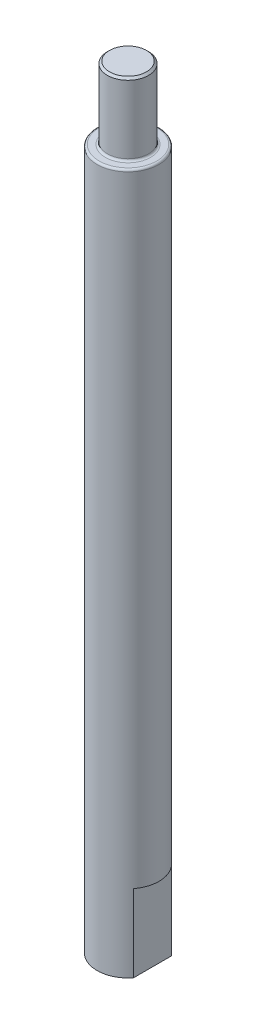
ISO-10303-21;
HEADER;
FILE_DESCRIPTION(('STEP AP214'),'2;1');
FILE_NAME('part.step','',(''),(''),'','','');
FILE_SCHEMA(('AUTOMOTIVE_DESIGN { 1 0 10303 214 1 1 1 1 }'));
ENDSEC;
DATA;
#1=APPLICATION_CONTEXT('core data for automotive mechanical design processes');
#2=APPLICATION_PROTOCOL_DEFINITION('international standard','automotive_design',2000,#1);
#3=PRODUCT_CONTEXT('',#1,'mechanical');
#4=PRODUCT('Part','Part','',(#3));
#5=PRODUCT_RELATED_PRODUCT_CATEGORY('part','',(#4));
#6=PRODUCT_DEFINITION_FORMATION('','',#4);
#7=PRODUCT_DEFINITION_CONTEXT('part definition',#1,'design');
#8=PRODUCT_DEFINITION('design','',#6,#7);
#9=PRODUCT_DEFINITION_SHAPE('','',#8);
#10=(LENGTH_UNIT() NAMED_UNIT(*) SI_UNIT(.MILLI.,.METRE.));
#11=(NAMED_UNIT(*) PLANE_ANGLE_UNIT() SI_UNIT($,.RADIAN.));
#12=(NAMED_UNIT(*) SI_UNIT($,.STERADIAN.) SOLID_ANGLE_UNIT());
#13=UNCERTAINTY_MEASURE_WITH_UNIT(LENGTH_MEASURE(1.E-05),#10,'distance_accuracy_value','');
#14=(GEOMETRIC_REPRESENTATION_CONTEXT(3) GLOBAL_UNCERTAINTY_ASSIGNED_CONTEXT((#13)) GLOBAL_UNIT_ASSIGNED_CONTEXT((#10,
#11,#12)) REPRESENTATION_CONTEXT('',''));
#15=CARTESIAN_POINT('',(0.,0.,0.));
#16=DIRECTION('',(0.,0.,1.));
#17=DIRECTION('',(1.,0.,0.));
#18=AXIS2_PLACEMENT_3D('',#15,#16,#17);
#19=CARTESIAN_POINT('',(0.,0.,0.));
#20=DIRECTION('',(0.,-1.,0.));
#21=DIRECTION('',(1.,0.,0.));
#22=AXIS2_PLACEMENT_3D('',#19,#20,#21);
#23=PLANE('',#22);
#24=CARTESIAN_POINT('',(0.,0.,0.));
#25=DIRECTION('',(0.,1.,0.));
#26=DIRECTION('',(-1.,0.,0.));
#27=AXIS2_PLACEMENT_3D('',#24,#25,#26);
#28=CIRCLE('',#27,5.99999999999999);
#29=CARTESIAN_POINT('',(4.74999999999999,0.,-3.66571957465378));
#30=VERTEX_POINT('',#29);
#31=CARTESIAN_POINT('',(-4.74999999999999,0.,-3.66571957465378));
#32=VERTEX_POINT('',#31);
#33=EDGE_CURVE('E88',#30,#32,#28,.T.);
#34=ORIENTED_EDGE('',*,*,#33,.F.);
#35=DIRECTION('',(0.,0.,1.));
#36=VECTOR('',#35,1.);
#37=CARTESIAN_POINT('',(4.74999999999999,0.,-15.));
#38=LINE('',#37,#36);
#39=CARTESIAN_POINT('',(4.74999999999999,0.,3.66571957465378));
#40=VERTEX_POINT('',#39);
#41=EDGE_CURVE('E73',#30,#40,#38,.T.);
#42=ORIENTED_EDGE('',*,*,#41,.T.);
#43=CARTESIAN_POINT('',(-4.74999999999999,0.,3.66571957465378));
#44=VERTEX_POINT('',#43);
#45=EDGE_CURVE('E95',#44,#40,#28,.T.);
#46=ORIENTED_EDGE('',*,*,#45,.F.);
#47=DIRECTION('',(0.,0.,1.));
#48=VECTOR('',#47,1.);
#49=CARTESIAN_POINT('',(-4.74999999999999,0.,-15.));
#50=LINE('',#49,#48);
#51=EDGE_CURVE('E94',#32,#44,#50,.T.);
#52=ORIENTED_EDGE('',*,*,#51,.F.);
#53=EDGE_LOOP('',(#34,#42,#46,#52));
#54=FACE_BOUND('',#53,.T.);
#55=ADVANCED_FACE('F33',(#54),#23,.T.);
#56=CARTESIAN_POINT('',(0.,150.,0.));
#57=DIRECTION('',(0.,1.,0.));
#58=DIRECTION('',(-1.,0.,0.));
#59=AXIS2_PLACEMENT_3D('',#56,#57,#58);
#60=CYLINDRICAL_SURFACE('',#59,5.99999999999998);
#61=CARTESIAN_POINT('',(0.,135.6,0.));
#62=DIRECTION('',(0.,1.,0.));
#63=DIRECTION('',(-1.,0.,0.));
#64=AXIS2_PLACEMENT_3D('',#61,#62,#63);
#65=CIRCLE('',#64,5.99999999999998);
#66=CARTESIAN_POINT('',(-5.99999999999999,135.6,0.));
#67=VERTEX_POINT('',#66);
#68=EDGE_CURVE('E41',#67,#67,#65,.F.);
#69=ORIENTED_EDGE('',*,*,#68,.T.);
#70=EDGE_LOOP('',(#69));
#71=FACE_BOUND('',#70,.T.);
#72=CARTESIAN_POINT('',(0.,15.,0.));
#73=DIRECTION('',(0.,-1.,0.));
#74=DIRECTION('',(0.,0.,-1.));
#75=AXIS2_PLACEMENT_3D('',#72,#73,#74);
#76=CIRCLE('',#75,5.99999999999998);
#77=CARTESIAN_POINT('',(4.74999999999999,15.,3.66571957465377));
#78=VERTEX_POINT('',#77);
#79=CARTESIAN_POINT('',(4.74999999999999,15.,-3.66571957465377));
#80=VERTEX_POINT('',#79);
#81=EDGE_CURVE('E90',#78,#80,#76,.F.);
#82=ORIENTED_EDGE('',*,*,#81,.T.);
#83=DIRECTION('',(0.,1.,0.));
#84=VECTOR('',#83,1.);
#85=CARTESIAN_POINT('',(4.75000000000001,150.,-3.66571957465374));
#86=LINE('',#85,#84);
#87=EDGE_CURVE('E76',#80,#30,#86,.F.);
#88=ORIENTED_EDGE('',*,*,#87,.T.);
#89=ORIENTED_EDGE('',*,*,#33,.T.);
#90=DIRECTION('',(0.,1.,0.));
#91=VECTOR('',#90,1.);
#92=CARTESIAN_POINT('',(-4.75000000000001,150.,-3.66571957465377));
#93=LINE('',#92,#91);
#94=CARTESIAN_POINT('',(-4.74999999999999,15.,-3.66571957465378));
#95=VERTEX_POINT('',#94);
#96=EDGE_CURVE('E104',#95,#32,#93,.F.);
#97=ORIENTED_EDGE('',*,*,#96,.F.);
#98=CARTESIAN_POINT('',(0.,15.,0.));
#99=DIRECTION('',(0.,1.,0.));
#100=DIRECTION('',(0.,0.,1.));
#101=AXIS2_PLACEMENT_3D('',#98,#99,#100);
#102=CIRCLE('',#101,5.99999999999998);
#103=CARTESIAN_POINT('',(-4.74999999999999,15.,3.66571957465378));
#104=VERTEX_POINT('',#103);
#105=EDGE_CURVE('E97',#104,#95,#102,.F.);
#106=ORIENTED_EDGE('',*,*,#105,.F.);
#107=DIRECTION('',(0.,1.,0.));
#108=VECTOR('',#107,1.);
#109=CARTESIAN_POINT('',(-4.75000000000001,150.,3.66571957465377));
#110=LINE('',#109,#108);
#111=EDGE_CURVE('E102',#44,#104,#110,.T.);
#112=ORIENTED_EDGE('',*,*,#111,.F.);
#113=ORIENTED_EDGE('',*,*,#45,.T.);
#114=DIRECTION('',(0.,1.,0.));
#115=VECTOR('',#114,1.);
#116=CARTESIAN_POINT('',(4.75000000000001,150.,3.66571957465374));
#117=LINE('',#116,#115);
#118=EDGE_CURVE('E79',#40,#78,#117,.T.);
#119=ORIENTED_EDGE('',*,*,#118,.T.);
#120=EDGE_LOOP('',(#82,#88,#89,#97,#106,#112,#113,#119));
#121=FACE_BOUND('',#120,.T.);
#122=ADVANCED_FACE('F86',(#71,#121),#60,.T.);
#123=CARTESIAN_POINT('',(-5.99999999999998,136.,0.));
#124=DIRECTION('',(0.,1.,0.));
#125=DIRECTION('',(-1.,0.,0.));
#126=AXIS2_PLACEMENT_3D('',#123,#124,#125);
#127=PLANE('',#126);
#128=CARTESIAN_POINT('',(0.,136.,0.));
#129=DIRECTION('',(0.,1.,0.));
#130=DIRECTION('',(-1.,0.,0.));
#131=AXIS2_PLACEMENT_3D('',#128,#129,#130);
#132=CIRCLE('',#131,5.59999999999998);
#133=CARTESIAN_POINT('',(-5.59999999999999,136.,0.));
#134=VERTEX_POINT('',#133);
#135=EDGE_CURVE('E116',#134,#134,#132,.T.);
#136=ORIENTED_EDGE('',*,*,#135,.T.);
#137=EDGE_LOOP('',(#136));
#138=FACE_BOUND('',#137,.T.);
#139=CARTESIAN_POINT('',(0.,136.,0.));
#140=DIRECTION('',(0.,1.,0.));
#141=DIRECTION('',(-1.,0.,0.));
#142=AXIS2_PLACEMENT_3D('',#139,#140,#141);
#143=CIRCLE('',#142,4.39999999999999);
#144=CARTESIAN_POINT('',(-4.4,136.,0.));
#145=VERTEX_POINT('',#144);
#146=EDGE_CURVE('E113',#145,#145,#143,.F.);
#147=ORIENTED_EDGE('',*,*,#146,.T.);
#148=EDGE_LOOP('',(#147));
#149=FACE_BOUND('',#148,.T.);
#150=ADVANCED_FACE('F128',(#138,#149),#127,.T.);
#151=CARTESIAN_POINT('',(0.,150.,0.));
#152=DIRECTION('',(0.,1.,0.));
#153=DIRECTION('',(-1.,0.,0.));
#154=AXIS2_PLACEMENT_3D('',#151,#152,#153);
#155=CYLINDRICAL_SURFACE('',#154,3.99999999999999);
#156=CARTESIAN_POINT('',(0.,136.4,0.));
#157=DIRECTION('',(0.,1.,0.));
#158=DIRECTION('',(-1.,0.,0.));
#159=AXIS2_PLACEMENT_3D('',#156,#157,#158);
#160=CIRCLE('',#159,3.99999999999999);
#161=CARTESIAN_POINT('',(-4.,136.4,0.));
#162=VERTEX_POINT('',#161);
#163=EDGE_CURVE('E11',#162,#162,#160,.T.);
#164=ORIENTED_EDGE('',*,*,#163,.T.);
#165=EDGE_LOOP('',(#164));
#166=FACE_BOUND('',#165,.T.);
#167=CARTESIAN_POINT('',(0.,149.6,0.));
#168=DIRECTION('',(0.,1.,0.));
#169=DIRECTION('',(-1.,0.,0.));
#170=AXIS2_PLACEMENT_3D('',#167,#168,#169);
#171=CIRCLE('',#170,3.99999999999999);
#172=CARTESIAN_POINT('',(-4.,149.6,0.));
#173=VERTEX_POINT('',#172);
#174=EDGE_CURVE('E110',#173,#173,#171,.F.);
#175=ORIENTED_EDGE('',*,*,#174,.T.);
#176=EDGE_LOOP('',(#175));
#177=FACE_BOUND('',#176,.T.);
#178=ADVANCED_FACE('F131',(#166,#177),#155,.T.);
#179=CARTESIAN_POINT('',(-4.,150.,0.));
#180=DIRECTION('',(0.,1.,0.));
#181=DIRECTION('',(-1.,0.,0.));
#182=AXIS2_PLACEMENT_3D('',#179,#180,#181);
#183=PLANE('',#182);
#184=CARTESIAN_POINT('',(0.,150.,0.));
#185=DIRECTION('',(0.,1.,0.));
#186=DIRECTION('',(-1.,0.,0.));
#187=AXIS2_PLACEMENT_3D('',#184,#185,#186);
#188=CIRCLE('',#187,3.59999999999995);
#189=CARTESIAN_POINT('',(-3.59999999999996,150.,0.));
#190=VERTEX_POINT('',#189);
#191=EDGE_CURVE('E91',#190,#190,#188,.T.);
#192=ORIENTED_EDGE('',*,*,#191,.T.);
#193=EDGE_LOOP('',(#192));
#194=FACE_BOUND('',#193,.T.);
#195=ADVANCED_FACE('F141',(#194),#183,.T.);
#196=CARTESIAN_POINT('',(-4.74999999999999,15.,-15.));
#197=DIRECTION('',(1.,0.,0.));
#198=DIRECTION('',(0.,1.,0.));
#199=AXIS2_PLACEMENT_3D('',#196,#197,#198);
#200=PLANE('',#199);
#201=ORIENTED_EDGE('',*,*,#96,.T.);
#202=ORIENTED_EDGE('',*,*,#51,.T.);
#203=ORIENTED_EDGE('',*,*,#111,.T.);
#204=DIRECTION('',(0.,0.,1.));
#205=VECTOR('',#204,1.);
#206=CARTESIAN_POINT('',(-4.74999999999999,15.,-15.));
#207=LINE('',#206,#205);
#208=EDGE_CURVE('E54',#95,#104,#207,.T.);
#209=ORIENTED_EDGE('',*,*,#208,.F.);
#210=EDGE_LOOP('',(#201,#202,#203,#209));
#211=FACE_BOUND('',#210,.T.);
#212=ADVANCED_FACE('F152',(#211),#200,.F.);
#213=CARTESIAN_POINT('',(-7.24999999999999,15.,-15.));
#214=DIRECTION('',(0.,1.,0.));
#215=DIRECTION('',(0.,0.,1.));
#216=AXIS2_PLACEMENT_3D('',#213,#214,#215);
#217=PLANE('',#216);
#218=ORIENTED_EDGE('',*,*,#105,.T.);
#219=ORIENTED_EDGE('',*,*,#208,.T.);
#220=EDGE_LOOP('',(#218,#219));
#221=FACE_BOUND('',#220,.T.);
#222=ADVANCED_FACE('F157',(#221),#217,.F.);
#223=CARTESIAN_POINT('',(4.74999999999999,15.,-15.));
#224=DIRECTION('',(1.,0.,0.));
#225=DIRECTION('',(0.,1.,0.));
#226=AXIS2_PLACEMENT_3D('',#223,#224,#225);
#227=PLANE('',#226);
#228=DIRECTION('',(0.,0.,1.));
#229=VECTOR('',#228,1.);
#230=CARTESIAN_POINT('',(4.74999999999999,15.,-15.));
#231=LINE('',#230,#229);
#232=EDGE_CURVE('E47',#80,#78,#231,.T.);
#233=ORIENTED_EDGE('',*,*,#232,.T.);
#234=ORIENTED_EDGE('',*,*,#118,.F.);
#235=ORIENTED_EDGE('',*,*,#41,.F.);
#236=ORIENTED_EDGE('',*,*,#87,.F.);
#237=EDGE_LOOP('',(#233,#234,#235,#236));
#238=FACE_BOUND('',#237,.T.);
#239=ADVANCED_FACE('F75',(#238),#227,.T.);
#240=CARTESIAN_POINT('',(7.24999999999999,15.,-15.));
#241=DIRECTION('',(0.,-1.,0.));
#242=DIRECTION('',(0.,0.,-1.));
#243=AXIS2_PLACEMENT_3D('',#240,#241,#242);
#244=PLANE('',#243);
#245=ORIENTED_EDGE('',*,*,#232,.F.);
#246=ORIENTED_EDGE('',*,*,#81,.F.);
#247=EDGE_LOOP('',(#245,#246));
#248=FACE_BOUND('',#247,.T.);
#249=ADVANCED_FACE('F147',(#248),#244,.T.);
#250=CARTESIAN_POINT('',(0.,150.,0.));
#251=DIRECTION('',(0.,-1.,0.));
#252=DIRECTION('',(1.,0.,0.));
#253=AXIS2_PLACEMENT_3D('',#250,#251,#252);
#254=CONICAL_SURFACE('',#253,3.59999999999995,0.785398163397485);
#255=ORIENTED_EDGE('',*,*,#174,.F.);
#256=EDGE_LOOP('',(#255));
#257=FACE_BOUND('',#256,.T.);
#258=ORIENTED_EDGE('',*,*,#191,.F.);
#259=EDGE_LOOP('',(#258));
#260=FACE_BOUND('',#259,.T.);
#261=ADVANCED_FACE('F125',(#257,#260),#254,.T.);
#262=CARTESIAN_POINT('',(0.,135.6,0.));
#263=DIRECTION('',(0.,1.,0.));
#264=DIRECTION('',(-1.,0.,0.));
#265=AXIS2_PLACEMENT_3D('',#262,#263,#264);
#266=TOROIDAL_SURFACE('',#265,5.59999999999998,0.4);
#267=ORIENTED_EDGE('',*,*,#68,.F.);
#268=EDGE_LOOP('',(#267));
#269=FACE_BOUND('',#268,.T.);
#270=ORIENTED_EDGE('',*,*,#135,.F.);
#271=EDGE_LOOP('',(#270));
#272=FACE_BOUND('',#271,.T.);
#273=ADVANCED_FACE('F122',(#269,#272),#266,.T.);
#274=CARTESIAN_POINT('',(0.,136.4,0.));
#275=DIRECTION('',(0.,1.,0.));
#276=DIRECTION('',(-1.,0.,0.));
#277=AXIS2_PLACEMENT_3D('',#274,#275,#276);
#278=TOROIDAL_SURFACE('',#277,4.39999999999999,0.4);
#279=ORIENTED_EDGE('',*,*,#146,.F.);
#280=EDGE_LOOP('',(#279));
#281=FACE_BOUND('',#280,.T.);
#282=ORIENTED_EDGE('',*,*,#163,.F.);
#283=EDGE_LOOP('',(#282));
#284=FACE_BOUND('',#283,.T.);
#285=ADVANCED_FACE('F35',(#281,#284),#278,.F.);
#286=CLOSED_SHELL('',(#55,#122,#150,#178,#195,#212,#222,#239,#249,#261,#273,#285));
#287=MANIFOLD_SOLID_BREP('B2',#286);
#288=ADVANCED_BREP_SHAPE_REPRESENTATION('',(#18,#287),#14);
#289=SHAPE_DEFINITION_REPRESENTATION(#9,#288);
ENDSEC;
END-ISO-10303-21;
